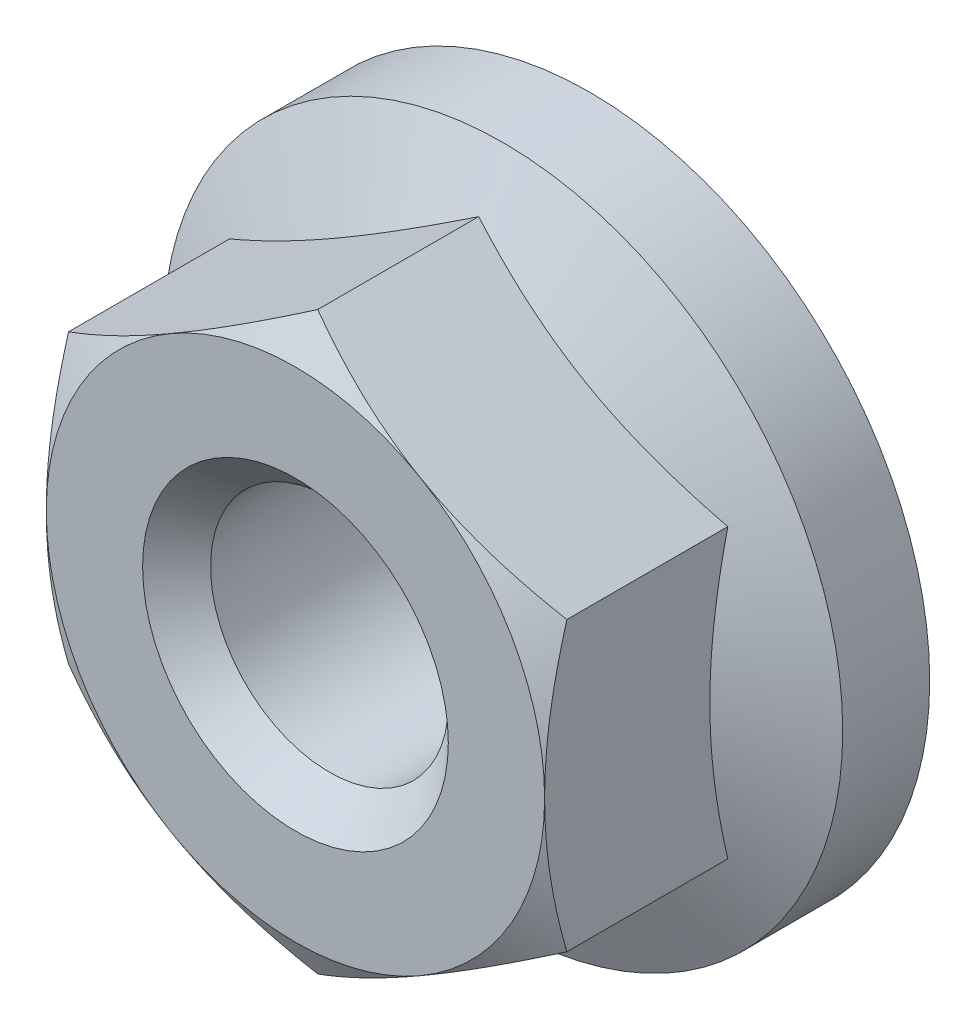
ISO-10303-21;
HEADER;
FILE_DESCRIPTION(('STEP AP214'),'2;1');
FILE_NAME('part.step','',(''),(''),'','','');
FILE_SCHEMA(('AUTOMOTIVE_DESIGN { 1 0 10303 214 1 1 1 1 }'));
ENDSEC;
DATA;
#1=APPLICATION_CONTEXT('core data for automotive mechanical design processes');
#2=APPLICATION_PROTOCOL_DEFINITION('international standard','automotive_design',2000,#1);
#3=PRODUCT_CONTEXT('',#1,'mechanical');
#4=PRODUCT('Part','Part','',(#3));
#5=PRODUCT_RELATED_PRODUCT_CATEGORY('part','',(#4));
#6=PRODUCT_DEFINITION_FORMATION('','',#4);
#7=PRODUCT_DEFINITION_CONTEXT('part definition',#1,'design');
#8=PRODUCT_DEFINITION('design','',#6,#7);
#9=PRODUCT_DEFINITION_SHAPE('','',#8);
#10=(LENGTH_UNIT() NAMED_UNIT(*) SI_UNIT(.MILLI.,.METRE.));
#11=(NAMED_UNIT(*) PLANE_ANGLE_UNIT() SI_UNIT($,.RADIAN.));
#12=(NAMED_UNIT(*) SI_UNIT($,.STERADIAN.) SOLID_ANGLE_UNIT());
#13=UNCERTAINTY_MEASURE_WITH_UNIT(LENGTH_MEASURE(1.E-05),#10,'distance_accuracy_value','');
#14=(GEOMETRIC_REPRESENTATION_CONTEXT(3) GLOBAL_UNCERTAINTY_ASSIGNED_CONTEXT((#13)) GLOBAL_UNIT_ASSIGNED_CONTEXT((#10,
#11,#12)) REPRESENTATION_CONTEXT('',''));
#15=CARTESIAN_POINT('',(0.,0.,0.));
#16=DIRECTION('',(0.,0.,1.));
#17=DIRECTION('',(1.,0.,0.));
#18=AXIS2_PLACEMENT_3D('',#15,#16,#17);
#19=CARTESIAN_POINT('',(0.,0.,-1.0556875));
#20=DIRECTION('',(0.,0.,-1.));
#21=DIRECTION('',(-1.,0.,0.));
#22=AXIS2_PLACEMENT_3D('',#19,#20,#21);
#23=CYLINDRICAL_SURFACE('',#22,2.0828);
#24=CARTESIAN_POINT('',(0.,0.,1.984375));
#25=DIRECTION('',(0.,0.,1.));
#26=DIRECTION('',(1.,0.,0.));
#27=AXIS2_PLACEMENT_3D('',#24,#25,#26);
#28=CIRCLE('',#27,2.0828);
#29=CARTESIAN_POINT('',(2.0828,0.,1.984375));
#30=VERTEX_POINT('',#29);
#31=EDGE_CURVE('E250',#30,#30,#28,.T.);
#32=ORIENTED_EDGE('',*,*,#31,.T.);
#33=EDGE_LOOP('',(#32));
#34=FACE_BOUND('',#33,.T.);
#35=CARTESIAN_POINT('',(0.,0.,-1.984375));
#36=DIRECTION('',(0.,0.,1.));
#37=DIRECTION('',(1.,0.,0.));
#38=AXIS2_PLACEMENT_3D('',#35,#36,#37);
#39=CIRCLE('',#38,2.0828);
#40=CARTESIAN_POINT('',(2.0828,0.,-1.984375));
#41=VERTEX_POINT('',#40);
#42=EDGE_CURVE('E53',#41,#41,#39,.F.);
#43=ORIENTED_EDGE('',*,*,#42,.T.);
#44=EDGE_LOOP('',(#43));
#45=FACE_BOUND('',#44,.T.);
#46=ADVANCED_FACE('F45',(#34,#45),#23,.F.);
#47=CARTESIAN_POINT('',(4.36562499999999,-2.52049476893095,2.5796875));
#48=DIRECTION('',(-1.,0.,0.));
#49=DIRECTION('',(0.,-1.,0.));
#50=AXIS2_PLACEMENT_3D('',#47,#48,#49);
#51=PLANE('',#50);
#52=CARTESIAN_POINT('',(4.365625,-6.60664399345358,-1.97226833605388));
#53=CARTESIAN_POINT('',(4.365625,-6.41093281341259,-1.89615105212342));
#54=CARTESIAN_POINT('',(4.365625,-6.21488345839632,-1.82088675112231));
#55=CARTESIAN_POINT('',(4.365625,-5.8219287229827,-1.6725494974028));
#56=CARTESIAN_POINT('',(4.365625,-5.62502323224388,-1.59947683734957));
#57=CARTESIAN_POINT('',(4.365625,-5.22954152141942,-1.45577913541881));
#58=CARTESIAN_POINT('',(4.365625,-5.03096187173488,-1.38516349683207));
#59=CARTESIAN_POINT('',(4.365625,-4.63262717448217,-1.2473392366526));
#60=CARTESIAN_POINT('',(4.365625,-4.43287216970846,-1.18013049186178));
#61=CARTESIAN_POINT('',(4.365625,-4.0352396282442,-1.05106617516828));
#62=CARTESIAN_POINT('',(4.365625,-3.83738479335021,-0.989141045710431));
#63=CARTESIAN_POINT('',(4.365625,-3.44009112088732,-0.87052511400839));
#64=CARTESIAN_POINT('',(4.36562499999999,-3.24065220149484,-0.813834584084636));
#65=CARTESIAN_POINT('',(4.36562499999999,-2.8401925308117,-0.707117768321716));
#66=CARTESIAN_POINT('',(4.36562499999999,-2.63917357656096,-0.657084822820685));
#67=CARTESIAN_POINT('',(4.36562499999999,-2.23528338920897,-0.565275961029053));
#68=CARTESIAN_POINT('',(4.36562499999999,-2.03241242391281,-0.523498870105913));
#69=CARTESIAN_POINT('',(4.36562499999999,-1.5502433680569,-0.436658518690269));
#70=CARTESIAN_POINT('',(4.36562499999999,-1.27011229597603,-0.39597500452531));
#71=CARTESIAN_POINT('',(4.36562499999999,-0.848209340326263,-0.352501513386403));
#72=CARTESIAN_POINT('',(4.36562499999999,-0.707314635336784,-0.340936119764732));
#73=CARTESIAN_POINT('',(4.36562499999999,-0.425143611925475,-0.32401529121301));
#74=CARTESIAN_POINT('',(4.36562499999999,-0.283867296581308,-0.318659806349439));
#75=CARTESIAN_POINT('',(4.36562499999999,-0.000398275889843799,-0.314345605247682));
#76=CARTESIAN_POINT('',(4.36562499999999,0.141794995613756,-0.315424137943703));
#77=CARTESIAN_POINT('',(4.36562499999999,0.425987036683269,-0.32402350415237));
#78=CARTESIAN_POINT('',(4.36562499999999,0.567985802407583,-0.331544463120178));
#79=CARTESIAN_POINT('',(4.36562499999999,0.851547659651012,-0.352762073380852));
#80=CARTESIAN_POINT('',(4.36562499999999,0.993110652860779,-0.366460028159263));
#81=CARTESIAN_POINT('',(4.36562499999999,1.27554275363206,-0.399580245891768));
#82=CARTESIAN_POINT('',(4.36562499999999,1.4164119098734,-0.41900210126684));
#83=CARTESIAN_POINT('',(4.36562499999999,2.00067719219713,-0.510509317060275));
#84=CARTESIAN_POINT('',(4.36562499999999,2.44050875761812,-0.605755319055588));
#85=CARTESIAN_POINT('',(4.36562499999999,3.09369680564782,-0.773315191169257));
#86=CARTESIAN_POINT('',(4.36562499999999,3.31052251368921,-0.833347923015837));
#87=CARTESIAN_POINT('',(4.36562499999999,3.74229501139436,-0.959863450758469));
#88=CARTESIAN_POINT('',(4.36562499999999,3.95724198038637,-1.02634562355258));
#89=CARTESIAN_POINT('',(4.36562499999999,4.38695059391623,-1.16477392669879));
#90=CARTESIAN_POINT('',(4.36562499999999,4.60170114849319,-1.23675397688996));
#91=CARTESIAN_POINT('',(4.36562499999999,5.02983726821637,-1.38466760127381));
#92=CARTESIAN_POINT('',(4.36562499999999,5.24322281220871,-1.46060123657025));
#93=CARTESIAN_POINT('',(4.36562499999999,5.66870443171552,-1.6155187648014));
#94=CARTESIAN_POINT('',(4.36562499999999,5.88080132708559,-1.69450041556498));
#95=CARTESIAN_POINT('',(4.36562499999999,6.30405963762542,-1.85493580058842));
#96=CARTESIAN_POINT('',(4.36562499999999,6.51522103745028,-1.93638957522767));
#97=CARTESIAN_POINT('',(4.36562499999999,7.14592518038851,-2.18306875846791));
#98=CARTESIAN_POINT('',(4.36562499999999,7.56432371053481,-2.35121691841306));
#99=CARTESIAN_POINT('',(4.36562499999999,8.39906567581811,-2.69273368884814));
#100=CARTESIAN_POINT('',(4.36562499999999,8.81540869142238,-2.86610331762184));
#101=CARTESIAN_POINT('',(4.36562499999999,9.64042944190495,-3.21388577952443));
#102=CARTESIAN_POINT('',(4.36562499999999,10.0491296197722,-3.38824545430547));
#103=CARTESIAN_POINT('',(4.36562499999999,10.661300445411,-3.65167502902517));
#104=CARTESIAN_POINT('',(4.36562499999998,10.865184067515,-3.739788189516));
#105=CARTESIAN_POINT('',(4.36562499999998,11.2727099754698,-3.91656846544385));
#106=CARTESIAN_POINT('',(4.36562499999998,11.4763522623943,-4.00523557840539));
#107=CARTESIAN_POINT('',(4.36562499999998,11.679891685479,-4.09413834940731));
#108=B_SPLINE_CURVE_WITH_KNOTS('',3,(#52,#53,#54,#55,#56,#57,#58,#59,#60,#61,#62,#63,#64,#65,
#66,#67,#68,#69,#70,#71,#72,#73,#74,#75,#76,#77,#78,#79,#80,#81,#82,#83,#84,#85,#86,#87,#88,#89,
#90,#91,#92,#93,#94,#95,#96,#97,#98,#99,#100,#101,#102,#103,#104,#105,#106,#107),.UNSPECIFIED.,
.F.,.F.,(4,2,2,2,2,2,2,2,2,2,2,2,2,2,2,2,2,2,2,2,2,2,2,2,2,2,2,4),(0.,0.629983444310105,
1.26005064351588,1.89231061306488,2.52454770286732,3.14644779877676,3.76838022969133,
4.38968578072315,5.01090286944214,5.85917091266729,6.28316135355655,6.70714838513929,
7.13359240922861,7.56004473777006,7.98658709952139,8.41309909601237,9.76057542104153,
10.4355130688722,11.1103855735503,11.7898234040978,12.469271738662,13.1482294465624,
13.8271982504528,15.1799045303391,16.5328763435044,17.8658803218238,18.5322071336423,
19.1985309699511),.UNSPECIFIED.);
#109=CARTESIAN_POINT('',(4.36562499999999,2.52049476893097,-0.630351748730272));
#110=VERTEX_POINT('',#109);
#111=CARTESIAN_POINT('',(4.36562499999999,-2.52049476893095,-0.630351748730269));
#112=VERTEX_POINT('',#111);
#113=EDGE_CURVE('E60',#110,#112,#108,.F.);
#114=ORIENTED_EDGE('',*,*,#113,.F.);
#115=DIRECTION('',(0.,0.,-1.));
#116=VECTOR('',#115,1.);
#117=CARTESIAN_POINT('',(4.36562499999999,2.52049476893097,2.5796875));
#118=LINE('',#117,#116);
#119=CARTESIAN_POINT('',(4.36562500000001,2.52049476893096,2.1897656022643));
#120=VERTEX_POINT('',#119);
#121=EDGE_CURVE('E233',#120,#110,#118,.T.);
#122=ORIENTED_EDGE('',*,*,#121,.F.);
#123=CARTESIAN_POINT('',(4.365625,-6.68472357029108,0.490619352130386));
#124=CARTESIAN_POINT('',(4.365625,-6.49304794649147,0.583247601576225));
#125=CARTESIAN_POINT('',(4.365625,-6.30091913696138,0.674955049234821));
#126=CARTESIAN_POINT('',(4.365625,-5.91551011235036,0.856002163894497));
#127=CARTESIAN_POINT('',(4.365625,-5.72222970491905,0.945341420940688));
#128=CARTESIAN_POINT('',(4.365625,-5.33322836526829,1.12159662139672));
#129=CARTESIAN_POINT('',(4.365625,-5.13749979647848,1.20849577146979));
#130=CARTESIAN_POINT('',(4.365625,-4.74443393172761,1.37856153998718));
#131=CARTESIAN_POINT('',(4.365625,-4.54709672025723,1.46172835299123));
#132=CARTESIAN_POINT('',(4.365625,-4.14804997464603,1.62432433210982));
#133=CARTESIAN_POINT('',(4.365625,-3.94631650504855,1.7036950764364));
#134=CARTESIAN_POINT('',(4.365625,-3.54046995624347,1.85622022770319));
#135=CARTESIAN_POINT('',(4.36562499999999,-3.33635661515233,1.92937394303145));
#136=CARTESIAN_POINT('',(4.36562499999999,-2.92584550484026,2.06749959311642));
#137=CARTESIAN_POINT('',(4.36562499999999,-2.71945364770364,2.13248892229756));
#138=CARTESIAN_POINT('',(4.36562499999999,-2.30373377742746,2.25217449846454));
#139=CARTESIAN_POINT('',(4.36562499999999,-2.09440671538953,2.30687400048986));
#140=CARTESIAN_POINT('',(4.36562499999999,-1.6726830200161,2.40332685882437));
#141=CARTESIAN_POINT('',(4.36562499999999,-1.46028558509209,2.44507676805484));
#142=CARTESIAN_POINT('',(4.36562499999999,-1.03290172953048,2.5128103168927));
#143=CARTESIAN_POINT('',(4.36562499999999,-0.817915306604055,2.5387939425607));
#144=CARTESIAN_POINT('',(4.36562499999999,-0.495089233151992,2.56427521684339));
#145=CARTESIAN_POINT('',(4.36562499999999,-0.387757075852365,2.57052124859524));
#146=CARTESIAN_POINT('',(4.36562499999999,-0.172927392335542,2.57847074854163));
#147=CARTESIAN_POINT('',(4.36562499999999,-0.0654298682840093,2.58017427572705));
#148=CARTESIAN_POINT('',(4.36562499999999,0.256965307685626,2.57836344443623));
#149=CARTESIAN_POINT('',(4.36562499999999,0.471867877291875,2.56793588098127));
#150=CARTESIAN_POINT('',(4.36562499999999,0.838818659922764,2.53507363216862));
#151=CARTESIAN_POINT('',(4.36562499999999,0.991279829530546,2.51692149116043));
#152=CARTESIAN_POINT('',(4.36562499999999,1.29502515414939,2.47249569049691));
#153=CARTESIAN_POINT('',(4.36562499999999,1.44630914944927,2.44622094785863));
#154=CARTESIAN_POINT('',(4.36562499999999,1.89827339753187,2.35658791641639));
#155=CARTESIAN_POINT('',(4.36562499999999,2.19683386468751,2.28244427940829));
#156=CARTESIAN_POINT('',(4.36562499999999,2.64358506393704,2.1545668821533));
#157=CARTESIAN_POINT('',(4.36562499999999,2.79410405673737,2.10851219794181));
#158=CARTESIAN_POINT('',(4.36562499999999,3.09357094763501,2.01184566510832));
#159=CARTESIAN_POINT('',(4.36562499999999,3.24251985129302,1.96123695971366));
#160=CARTESIAN_POINT('',(4.36562499999999,3.53822380892041,1.85651549643316));
#161=CARTESIAN_POINT('',(4.36562499999999,3.68498649235853,1.80242406509119));
#162=CARTESIAN_POINT('',(4.36562499999999,3.97737317703636,1.69106632903171));
#163=CARTESIAN_POINT('',(4.36562499999999,4.12299669053638,1.6337987411384));
#164=CARTESIAN_POINT('',(4.36562499999999,4.26809365222194,1.57525649832899));
#165=B_SPLINE_CURVE_WITH_KNOTS('',3,(#123,#124,#125,#126,#127,#128,#129,#130,#131,#132,#133,
#134,#135,#136,#137,#138,#139,#140,#141,#142,#143,#144,#145,#146,#147,#148,#149,#150,#151,#152,
#153,#154,#155,#156,#157,#158,#159,#160,#161,#162,#163,#164),.UNSPECIFIED.,.F.,.F.,(4,2,2,2,2,2,
2,2,2,2,2,2,2,2,2,2,2,2,2,2,4),(0.,0.638660151693423,1.27743014855248,1.91985556812849,
2.56224746028049,3.21252593119908,3.86287664776039,4.51181739048863,5.16055250362408,
5.80946015698262,6.45836838405626,6.78082333641526,7.10327410121856,7.74786871494334,
8.2082680220623,8.6687287405146,9.59034671260758,10.0625304265247,10.5343906987153,
11.0035950242802,11.4729903103898),.UNSPECIFIED.);
#166=CARTESIAN_POINT('',(4.36562499999999,0.,2.5796875));
#167=VERTEX_POINT('',#166);
#168=EDGE_CURVE('E219',#167,#120,#165,.T.);
#169=ORIENTED_EDGE('',*,*,#168,.F.);
#170=CARTESIAN_POINT('',(4.36562500000002,-2.52049476893094,2.1897656022643));
#171=VERTEX_POINT('',#170);
#172=EDGE_CURVE('E225',#171,#167,#165,.T.);
#173=ORIENTED_EDGE('',*,*,#172,.F.);
#174=DIRECTION('',(0.,0.,-1.));
#175=VECTOR('',#174,1.);
#176=CARTESIAN_POINT('',(4.36562499999999,-2.52049476893095,2.5796875));
#177=LINE('',#176,#175);
#178=EDGE_CURVE('E130',#171,#112,#177,.T.);
#179=ORIENTED_EDGE('',*,*,#178,.T.);
#180=EDGE_LOOP('',(#114,#122,#169,#173,#179));
#181=FACE_BOUND('',#180,.T.);
#182=ADVANCED_FACE('F198',(#181),#51,.F.);
#183=CARTESIAN_POINT('',(4.36562499999999,2.52049476893097,2.5796875));
#184=DIRECTION('',(-0.5,-0.866025403784439,0.));
#185=DIRECTION('',(0.866025403784439,-0.5,0.));
#186=AXIS2_PLACEMENT_3D('',#183,#184,#185);
#187=PLANE('',#186);
#188=CARTESIAN_POINT('',(-0.00020000000000374,5.04110500791577,-0.63040559515069));
#189=CARTESIAN_POINT('',(0.131826476473051,4.96487948618389,-0.594860279484385));
#190=CARTESIAN_POINT('',(0.264340111578985,4.88837270328418,-0.561597535493241));
#191=CARTESIAN_POINT('',(0.530361820455057,4.7347849980543,-0.50042952303362));
#192=CARTESIAN_POINT('',(0.663870391926843,4.65770378837594,-0.472527153156951));
#193=CARTESIAN_POINT('',(0.931885071333244,4.50296544107388,-0.422889063792162));
#194=CARTESIAN_POINT('',(1.0663919965592,4.42530783158681,-0.401159145422321));
#195=CARTESIAN_POINT('',(1.33609546225337,4.26959446306691,-0.364668082825573));
#196=CARTESIAN_POINT('',(1.47129186870673,4.19153878140759,-0.349905632875203));
#197=CARTESIAN_POINT('',(1.73934156536304,4.03678021688687,-0.328165012874994));
#198=CARTESIAN_POINT('',(1.87218531219099,3.9600828438956,-0.321031779418591));
#199=CARTESIAN_POINT('',(2.13802605915345,3.80659961707524,-0.314311443738025));
#200=CARTESIAN_POINT('',(2.2710230679426,3.72981375824942,-0.314724790882686));
#201=CARTESIAN_POINT('',(2.53671265532347,3.57641780345419,-0.3230767786528));
#202=CARTESIAN_POINT('',(2.66940540211807,3.49980761037282,-0.3310084055696));
#203=CARTESIAN_POINT('',(2.93430604759444,3.34686715139853,-0.354055451574821));
#204=CARTESIAN_POINT('',(3.06651398927821,3.2705368606784,-0.369170217189841));
#205=CARTESIAN_POINT('',(3.29616871952191,3.13794564035153,-0.401246827108555));
#206=CARTESIAN_POINT('',(3.39377465467736,3.08159282741502,-0.416723449578685));
#207=CARTESIAN_POINT('',(3.58854028789373,2.96914483664866,-0.451019313725859));
#208=CARTESIAN_POINT('',(3.68570000432623,2.91304964821197,-0.46983841649846));
#209=CARTESIAN_POINT('',(3.88032395573245,2.80068345747685,-0.510675646183818));
#210=CARTESIAN_POINT('',(3.97778427494457,2.74441471594442,-0.532718468045618));
#211=CARTESIAN_POINT('',(4.17218952681947,2.63217479144257,-0.579567865033983));
#212=CARTESIAN_POINT('',(4.26913454300124,2.57620356025343,-0.604373977037499));
#213=CARTESIAN_POINT('',(4.36582499999999,2.52037929887713,-0.630405595150681));
#214=B_SPLINE_CURVE_WITH_KNOTS('',3,(#188,#189,#190,#191,#192,#193,#194,#195,#196,#197,#198,
#199,#200,#201,#202,#203,#204,#205,#206,#207,#208,#209,#210,#211,#212,#213),.UNSPECIFIED.,.F.,
.F.,(4,2,2,2,2,2,2,2,2,2,2,2,4),(0.,0.469646851478608,0.939546951369879,1.40988723200695,
1.88013933450051,2.34064054105605,2.80116916871416,3.26126859739288,3.72132617734602,
4.06256608371574,4.40379181239433,4.74778354166053,5.09171770495247),.UNSPECIFIED.);
#215=CARTESIAN_POINT('',(0.,5.04098953786193,-0.630351748730276));
#216=VERTEX_POINT('',#215);
#217=EDGE_CURVE('E67',#216,#110,#214,.T.);
#218=ORIENTED_EDGE('',*,*,#217,.F.);
#219=DIRECTION('',(0.,0.,-1.));
#220=VECTOR('',#219,1.);
#221=CARTESIAN_POINT('',(0.,5.04098953786193,2.5796875));
#222=LINE('',#221,#220);
#223=CARTESIAN_POINT('',(0.,5.04098953786193,2.1897656022643));
#224=VERTEX_POINT('',#223);
#225=EDGE_CURVE('E231',#224,#216,#222,.T.);
#226=ORIENTED_EDGE('',*,*,#225,.F.);
#227=CARTESIAN_POINT('',(4.36582499999999,2.52037929887713,2.18969893330707));
#228=CARTESIAN_POINT('',(4.17397884524336,2.63114172796887,2.25367053939288));
#229=CARTESIAN_POINT('',(3.98047668465206,2.74286025247503,2.31185020339327));
#230=CARTESIAN_POINT('',(3.59012172786329,2.96823179185653,2.41340297894961));
#231=CARTESIAN_POINT('',(3.39326199603344,3.08188881102109,2.45674016558375));
#232=CARTESIAN_POINT('',(3.00198221769428,3.30779429637366,2.52420024711872));
#233=CARTESIAN_POINT('',(2.80762237147348,3.4200080059089,2.5487721340745));
#234=CARTESIAN_POINT('',(2.41798823215202,3.64496338113161,2.57810489318914));
#235=CARTESIAN_POINT('',(2.22271535509829,3.75770422926401,2.5828900564277));
#236=CARTESIAN_POINT('',(1.85784257149213,3.968363629099,2.57293087568916));
#237=CARTESIAN_POINT('',(1.68818802211312,4.06631372885221,2.56063184705368));
#238=CARTESIAN_POINT('',(1.34998421225434,4.26157578951514,2.52165250734802));
#239=CARTESIAN_POINT('',(1.18143612140104,4.35888707514069,2.49495888313893));
#240=CARTESIAN_POINT('',(0.842535099477596,4.55455167137683,2.42822742336617));
#241=CARTESIAN_POINT('',(0.672225057879171,4.65288021973937,2.38790673834841));
#242=CARTESIAN_POINT('',(0.334144990416693,4.84807083769648,2.29639484471812));
#243=CARTESIAN_POINT('',(0.16637063383711,4.94493540763082,2.24522513580728));
#244=CARTESIAN_POINT('',(-0.000200000000004087,5.04110500791577,2.18969893330706));
#245=B_SPLINE_CURVE_WITH_KNOTS('',3,(#227,#228,#229,#230,#231,#232,#233,#234,#235,#236,#237,
#238,#239,#240,#241,#242,#243,#244),.UNSPECIFIED.,.F.,.F.,(4,2,2,2,2,2,2,2,4),(0.,
0.692002325262094,1.38566793682621,2.06216593124082,2.73783317900963,3.32613108280981,
3.91497402160195,4.51687782793767,5.11759979729737),.UNSPECIFIED.);
#246=CARTESIAN_POINT('',(2.1828125,3.78074215339644,2.5796875));
#247=VERTEX_POINT('',#246);
#248=EDGE_CURVE('E204',#247,#224,#245,.T.);
#249=ORIENTED_EDGE('',*,*,#248,.F.);
#250=EDGE_CURVE('E211',#120,#247,#245,.T.);
#251=ORIENTED_EDGE('',*,*,#250,.F.);
#252=ORIENTED_EDGE('',*,*,#121,.T.);
#253=EDGE_LOOP('',(#218,#226,#249,#251,#252));
#254=FACE_BOUND('',#253,.T.);
#255=ADVANCED_FACE('F194',(#254),#187,.F.);
#256=CARTESIAN_POINT('',(0.,5.04098953786193,2.5796875));
#257=DIRECTION('',(0.5,-0.866025403784438,0.));
#258=DIRECTION('',(0.866025403784438,0.5,0.));
#259=AXIS2_PLACEMENT_3D('',#256,#257,#258);
#260=PLANE('',#259);
#261=CARTESIAN_POINT('',(-4.365825,2.52037929887713,-0.630405595150689));
#262=CARTESIAN_POINT('',(-4.23379852352695,2.596604820609,-0.594860279484385));
#263=CARTESIAN_POINT('',(-4.10128488842102,2.67311160350871,-0.561597535493242));
#264=CARTESIAN_POINT('',(-3.83526317954494,2.82669930873859,-0.50042952303362));
#265=CARTESIAN_POINT('',(-3.70175460807316,2.90378051841695,-0.472527153156951));
#266=CARTESIAN_POINT('',(-3.43373992866676,3.05851886571901,-0.422889063792162));
#267=CARTESIAN_POINT('',(-3.2992330034408,3.13617647520608,-0.401159145422321));
#268=CARTESIAN_POINT('',(-3.02952953774664,3.29188984372598,-0.364668082825574));
#269=CARTESIAN_POINT('',(-2.89433313129327,3.36994552538531,-0.349905632875203));
#270=CARTESIAN_POINT('',(-2.62628343463697,3.52470408990602,-0.328165012874994));
#271=CARTESIAN_POINT('',(-2.49343968780902,3.60140146289729,-0.321031779418592));
#272=CARTESIAN_POINT('',(-2.22759894084655,3.75488468971765,-0.314311443738026));
#273=CARTESIAN_POINT('',(-2.09460193205741,3.83167054854347,-0.314724790882687));
#274=CARTESIAN_POINT('',(-1.82891234467654,3.9850665033387,-0.323076778652801));
#275=CARTESIAN_POINT('',(-1.69621959788193,4.06167669642008,-0.331008405569601));
#276=CARTESIAN_POINT('',(-1.43131895240556,4.21461715539436,-0.354055451574821));
#277=CARTESIAN_POINT('',(-1.29911101072179,4.29094744611449,-0.369170217189842));
#278=CARTESIAN_POINT('',(-1.06945628047809,4.42353866644136,-0.401246827108556));
#279=CARTESIAN_POINT('',(-0.971850345322642,4.47989147937787,-0.416723449578686));
#280=CARTESIAN_POINT('',(-0.777084712106271,4.59233947014423,-0.45101931372586));
#281=CARTESIAN_POINT('',(-0.67992499567377,4.64843465858092,-0.469838416498462));
#282=CARTESIAN_POINT('',(-0.485301044267554,4.76080084931605,-0.51067564618382));
#283=CARTESIAN_POINT('',(-0.387840725055425,4.81706959084848,-0.532718468045621));
#284=CARTESIAN_POINT('',(-0.193435473180524,4.92930951535033,-0.579567865033987));
#285=CARTESIAN_POINT('',(-0.0964904569987509,4.98528074653947,-0.604373977037503));
#286=CARTESIAN_POINT('',(0.000199999999997226,5.04110500791577,-0.630405595150686));
#287=B_SPLINE_CURVE_WITH_KNOTS('',3,(#261,#262,#263,#264,#265,#266,#267,#268,#269,#270,#271,
#272,#273,#274,#275,#276,#277,#278,#279,#280,#281,#282,#283,#284,#285,#286),.UNSPECIFIED.,.F.,
.F.,(4,2,2,2,2,2,2,2,2,2,2,2,4),(0.,0.469646851478607,0.939546951369878,1.40988723200695,
1.88013933450051,2.34064054105604,2.80116916871415,3.26126859739288,3.72132617734602,
4.06256608371574,4.40379181239433,4.74778354166054,5.09171770495248),.UNSPECIFIED.);
#288=CARTESIAN_POINT('',(-4.365625,2.52049476893096,-0.630351748730276));
#289=VERTEX_POINT('',#288);
#290=EDGE_CURVE('E176',#289,#216,#287,.T.);
#291=ORIENTED_EDGE('',*,*,#290,.F.);
#292=DIRECTION('',(0.,0.,-1.));
#293=VECTOR('',#292,1.);
#294=CARTESIAN_POINT('',(-4.365625,2.52049476893096,2.5796875));
#295=LINE('',#294,#293);
#296=CARTESIAN_POINT('',(-4.365625,2.52049476893097,2.1897656022643));
#297=VERTEX_POINT('',#296);
#298=EDGE_CURVE('E228',#297,#289,#295,.T.);
#299=ORIENTED_EDGE('',*,*,#298,.F.);
#300=CARTESIAN_POINT('',(0.000199999999996312,5.04110500791577,2.18969893330706));
#301=CARTESIAN_POINT('',(-0.191646154756636,4.93034257882403,2.25367053939287));
#302=CARTESIAN_POINT('',(-0.385148315347938,4.81862405431787,2.31185020339327));
#303=CARTESIAN_POINT('',(-0.775503272136701,4.59325251493637,2.4134029789496));
#304=CARTESIAN_POINT('',(-0.972363003966554,4.47959549577181,2.45674016558374));
#305=CARTESIAN_POINT('',(-1.36364278230571,4.25369001041924,2.52420024711872));
#306=CARTESIAN_POINT('',(-1.55800262852651,4.141476300884,2.5487721340745));
#307=CARTESIAN_POINT('',(-1.94763676784797,3.91652092566129,2.57810489318914));
#308=CARTESIAN_POINT('',(-2.1429096449017,3.80378007752888,2.5828900564277));
#309=CARTESIAN_POINT('',(-2.50778242850787,3.5931206776939,2.57293087568916));
#310=CARTESIAN_POINT('',(-2.67743697788688,3.49517057794068,2.56063184705368));
#311=CARTESIAN_POINT('',(-3.01564078774566,3.29990851727776,2.52165250734802));
#312=CARTESIAN_POINT('',(-3.18418887859896,3.20259723165221,2.49495888313893));
#313=CARTESIAN_POINT('',(-3.5230899005224,3.00693263541607,2.42822742336617));
#314=CARTESIAN_POINT('',(-3.69339994212083,2.90860408705352,2.38790673834841));
#315=CARTESIAN_POINT('',(-4.03148000958331,2.71341346909641,2.29639484471812));
#316=CARTESIAN_POINT('',(-4.19925436616289,2.61654889916207,2.24522513580728));
#317=CARTESIAN_POINT('',(-4.365825,2.52037929887713,2.18969893330706));
#318=B_SPLINE_CURVE_WITH_KNOTS('',3,(#300,#301,#302,#303,#304,#305,#306,#307,#308,#309,#310,
#311,#312,#313,#314,#315,#316,#317),.UNSPECIFIED.,.F.,.F.,(4,2,2,2,2,2,2,2,4),(0.,
0.692002325262095,1.38566793682621,2.06216593124082,2.73783317900963,3.32613108280982,
3.91497402160196,4.51687782793768,5.11759979729738),.UNSPECIFIED.);
#319=CARTESIAN_POINT('',(-2.18281250000001,3.78074215339645,2.5796875));
#320=VERTEX_POINT('',#319);
#321=EDGE_CURVE('E213',#320,#297,#318,.T.);
#322=ORIENTED_EDGE('',*,*,#321,.F.);
#323=EDGE_CURVE('E212',#224,#320,#318,.T.);
#324=ORIENTED_EDGE('',*,*,#323,.F.);
#325=ORIENTED_EDGE('',*,*,#225,.T.);
#326=EDGE_LOOP('',(#291,#299,#322,#324,#325));
#327=FACE_BOUND('',#326,.T.);
#328=ADVANCED_FACE('F197',(#327),#260,.F.);
#329=CARTESIAN_POINT('',(-4.365625,2.52049476893096,2.5796875));
#330=DIRECTION('',(1.,0.,0.));
#331=DIRECTION('',(0.,0.,-1.));
#332=AXIS2_PLACEMENT_3D('',#329,#330,#331);
#333=PLANE('',#332);
#334=CARTESIAN_POINT('',(-4.365625,-6.6066439934536,-1.97226833605389));
#335=CARTESIAN_POINT('',(-4.365625,-6.41093281341261,-1.89615105212343));
#336=CARTESIAN_POINT('',(-4.365625,-6.21488345839633,-1.82088675112232));
#337=CARTESIAN_POINT('',(-4.365625,-5.82192872298271,-1.67254949740281));
#338=CARTESIAN_POINT('',(-4.365625,-5.62502323224389,-1.59947683734958));
#339=CARTESIAN_POINT('',(-4.365625,-5.22954152141944,-1.45577913541882));
#340=CARTESIAN_POINT('',(-4.365625,-5.03096187173489,-1.38516349683208));
#341=CARTESIAN_POINT('',(-4.365625,-4.63262717448218,-1.24733923665261));
#342=CARTESIAN_POINT('',(-4.365625,-4.43287216970847,-1.18013049186179));
#343=CARTESIAN_POINT('',(-4.365625,-4.03523962824421,-1.05106617516828));
#344=CARTESIAN_POINT('',(-4.365625,-3.83738479335022,-0.989141045710437));
#345=CARTESIAN_POINT('',(-4.365625,-3.44009112088733,-0.870525114008396));
#346=CARTESIAN_POINT('',(-4.365625,-3.24065220149485,-0.813834584084642));
#347=CARTESIAN_POINT('',(-4.365625,-2.8401925308117,-0.707117768321721));
#348=CARTESIAN_POINT('',(-4.365625,-2.63917357656096,-0.65708482282069));
#349=CARTESIAN_POINT('',(-4.365625,-2.23528338920898,-0.565275961029057));
#350=CARTESIAN_POINT('',(-4.365625,-2.03241242391281,-0.523498870105917));
#351=CARTESIAN_POINT('',(-4.365625,-1.5502433680569,-0.436658518690275));
#352=CARTESIAN_POINT('',(-4.365625,-1.27011229597603,-0.395975004525316));
#353=CARTESIAN_POINT('',(-4.365625,-0.848209340326264,-0.352501513386409));
#354=CARTESIAN_POINT('',(-4.365625,-0.707314635336785,-0.340936119764737));
#355=CARTESIAN_POINT('',(-4.365625,-0.425143611925475,-0.324015291213015));
#356=CARTESIAN_POINT('',(-4.365625,-0.283867296581308,-0.318659806349444));
#357=CARTESIAN_POINT('',(-4.365625,-0.000398275889843122,-0.314345605247688));
#358=CARTESIAN_POINT('',(-4.365625,0.141794995613757,-0.315424137943709));
#359=CARTESIAN_POINT('',(-4.365625,0.425987036683271,-0.324023504152376));
#360=CARTESIAN_POINT('',(-4.365625,0.567985802407585,-0.331544463120183));
#361=CARTESIAN_POINT('',(-4.365625,0.851547659651015,-0.352762073380858));
#362=CARTESIAN_POINT('',(-4.365625,0.993110652860782,-0.366460028159269));
#363=CARTESIAN_POINT('',(-4.365625,1.27554275363207,-0.399580245891775));
#364=CARTESIAN_POINT('',(-4.365625,1.4164119098734,-0.419002101266846));
#365=CARTESIAN_POINT('',(-4.365625,2.00067719219714,-0.510509317060281));
#366=CARTESIAN_POINT('',(-4.365625,2.44050875761812,-0.605755319055594));
#367=CARTESIAN_POINT('',(-4.365625,3.09369680564783,-0.773315191169264));
#368=CARTESIAN_POINT('',(-4.365625,3.31052251368922,-0.833347923015845));
#369=CARTESIAN_POINT('',(-4.365625,3.74229501139437,-0.959863450758476));
#370=CARTESIAN_POINT('',(-4.365625,3.95724198038638,-1.02634562355259));
#371=CARTESIAN_POINT('',(-4.365625,4.38695059391623,-1.1647739266988));
#372=CARTESIAN_POINT('',(-4.365625,4.6017011484932,-1.23675397688997));
#373=CARTESIAN_POINT('',(-4.365625,5.02983726821638,-1.38466760127382));
#374=CARTESIAN_POINT('',(-4.365625,5.24322281220871,-1.46060123657025));
#375=CARTESIAN_POINT('',(-4.365625,5.66870443171552,-1.61551876480141));
#376=CARTESIAN_POINT('',(-4.365625,5.88080132708559,-1.69450041556498));
#377=CARTESIAN_POINT('',(-4.365625,6.30405963762543,-1.85493580058843));
#378=CARTESIAN_POINT('',(-4.365625,6.51522103745029,-1.93638957522768));
#379=CARTESIAN_POINT('',(-4.365625,7.14592518038851,-2.18306875846791));
#380=CARTESIAN_POINT('',(-4.365625,7.56432371053482,-2.35121691841307));
#381=CARTESIAN_POINT('',(-4.365625,8.39906567581812,-2.69273368884814));
#382=CARTESIAN_POINT('',(-4.365625,8.81540869142239,-2.86610331762185));
#383=CARTESIAN_POINT('',(-4.365625,9.64042944190495,-3.21388577952444));
#384=CARTESIAN_POINT('',(-4.365625,10.0491296197722,-3.38824545430547));
#385=CARTESIAN_POINT('',(-4.365625,10.661300445411,-3.65167502902517));
#386=CARTESIAN_POINT('',(-4.365625,10.865184067515,-3.73978818951601));
#387=CARTESIAN_POINT('',(-4.365625,11.2727099754698,-3.91656846544385));
#388=CARTESIAN_POINT('',(-4.365625,11.4763522623943,-4.0052355784054));
#389=CARTESIAN_POINT('',(-4.365625,11.679891685479,-4.09413834940731));
#390=B_SPLINE_CURVE_WITH_KNOTS('',3,(#334,#335,#336,#337,#338,#339,#340,#341,#342,#343,#344,
#345,#346,#347,#348,#349,#350,#351,#352,#353,#354,#355,#356,#357,#358,#359,#360,#361,#362,#363,
#364,#365,#366,#367,#368,#369,#370,#371,#372,#373,#374,#375,#376,#377,#378,#379,#380,#381,#382,
#383,#384,#385,#386,#387,#388,#389),.UNSPECIFIED.,.F.,.F.,(4,2,2,2,2,2,2,2,2,2,2,2,2,2,2,2,2,2,
2,2,2,2,2,2,2,2,2,4),(0.,0.629983444310108,1.26005064351589,1.89231061306489,2.52454770286733,
3.14644779877677,3.76838022969134,4.38968578072316,5.01090286944216,5.85917091266731,
6.28316135355656,6.70714838513931,7.13359240922863,7.56004473777008,7.98658709952141,
8.41309909601239,9.76057542104155,10.4355130688723,11.1103855735503,11.7898234040979,
12.469271738662,13.1482294465624,13.8271982504529,15.1799045303392,16.5328763435044,
17.8658803218238,18.5322071336423,19.1985309699511),.UNSPECIFIED.);
#391=CARTESIAN_POINT('',(-4.365625,-2.52049476893096,-0.630351748730274));
#392=VERTEX_POINT('',#391);
#393=EDGE_CURVE('E140',#392,#289,#390,.T.);
#394=ORIENTED_EDGE('',*,*,#393,.F.);
#395=DIRECTION('',(0.,0.,-1.));
#396=VECTOR('',#395,1.);
#397=CARTESIAN_POINT('',(-4.365625,-2.52049476893096,2.5796875));
#398=LINE('',#397,#396);
#399=CARTESIAN_POINT('',(-4.36562500000001,-2.52049476893095,2.1897656022643));
#400=VERTEX_POINT('',#399);
#401=EDGE_CURVE('E129',#400,#392,#398,.T.);
#402=ORIENTED_EDGE('',*,*,#401,.F.);
#403=CARTESIAN_POINT('',(-4.365625,-6.6847235702911,0.490619352130377));
#404=CARTESIAN_POINT('',(-4.365625,-6.49304794649149,0.583247601576216));
#405=CARTESIAN_POINT('',(-4.365625,-6.3009191369614,0.674955049234812));
#406=CARTESIAN_POINT('',(-4.365625,-5.91551011235037,0.856002163894489));
#407=CARTESIAN_POINT('',(-4.365625,-5.72222970491906,0.94534142094068));
#408=CARTESIAN_POINT('',(-4.365625,-5.3332283652683,1.12159662139671));
#409=CARTESIAN_POINT('',(-4.365625,-5.13749979647849,1.20849577146979));
#410=CARTESIAN_POINT('',(-4.365625,-4.74443393172762,1.37856153998717));
#411=CARTESIAN_POINT('',(-4.365625,-4.54709672025724,1.46172835299122));
#412=CARTESIAN_POINT('',(-4.365625,-4.14804997464604,1.62432433210981));
#413=CARTESIAN_POINT('',(-4.365625,-3.94631650504856,1.7036950764364));
#414=CARTESIAN_POINT('',(-4.365625,-3.54046995624347,1.85622022770318));
#415=CARTESIAN_POINT('',(-4.365625,-3.33635661515234,1.92937394303145));
#416=CARTESIAN_POINT('',(-4.365625,-2.92584550484027,2.06749959311641));
#417=CARTESIAN_POINT('',(-4.365625,-2.71945364770365,2.13248892229755));
#418=CARTESIAN_POINT('',(-4.365625,-2.30373377742747,2.25217449846453));
#419=CARTESIAN_POINT('',(-4.365625,-2.09440671538954,2.30687400048985));
#420=CARTESIAN_POINT('',(-4.365625,-1.6726830200161,2.40332685882437));
#421=CARTESIAN_POINT('',(-4.365625,-1.4602855850921,2.44507676805484));
#422=CARTESIAN_POINT('',(-4.365625,-1.03290172953048,2.51281031689269));
#423=CARTESIAN_POINT('',(-4.365625,-0.817915306604054,2.5387939425607));
#424=CARTESIAN_POINT('',(-4.365625,-0.495089233151991,2.56427521684339));
#425=CARTESIAN_POINT('',(-4.365625,-0.387757075852364,2.57052124859523));
#426=CARTESIAN_POINT('',(-4.365625,-0.172927392335541,2.57847074854162));
#427=CARTESIAN_POINT('',(-4.365625,-0.0654298682840075,2.58017427572704));
#428=CARTESIAN_POINT('',(-4.365625,0.256965307685629,2.57836344443622));
#429=CARTESIAN_POINT('',(-4.365625,0.471867877291878,2.56793588098126));
#430=CARTESIAN_POINT('',(-4.365625,0.838818659922767,2.53507363216862));
#431=CARTESIAN_POINT('',(-4.365625,0.99127982953055,2.51692149116042));
#432=CARTESIAN_POINT('',(-4.365625,1.2950251541494,2.4724956904969));
#433=CARTESIAN_POINT('',(-4.365625,1.44630914944928,2.44622094785862));
#434=CARTESIAN_POINT('',(-4.365625,1.89827339753188,2.35658791641638));
#435=CARTESIAN_POINT('',(-4.365625,2.19683386468752,2.28244427940828));
#436=CARTESIAN_POINT('',(-4.365625,2.64358506393705,2.15456688215329));
#437=CARTESIAN_POINT('',(-4.365625,2.79410405673738,2.1085121979418));
#438=CARTESIAN_POINT('',(-4.365625,3.09357094763502,2.01184566510831));
#439=CARTESIAN_POINT('',(-4.365625,3.24251985129303,1.96123695971365));
#440=CARTESIAN_POINT('',(-4.365625,3.53822380892042,1.85651549643315));
#441=CARTESIAN_POINT('',(-4.365625,3.68498649235854,1.80242406509118));
#442=CARTESIAN_POINT('',(-4.365625,3.97737317703638,1.6910663290317));
#443=CARTESIAN_POINT('',(-4.365625,4.1229966905364,1.63379874113839));
#444=CARTESIAN_POINT('',(-4.365625,4.26809365222196,1.57525649832898));
#445=B_SPLINE_CURVE_WITH_KNOTS('',3,(#403,#404,#405,#406,#407,#408,#409,#410,#411,#412,#413,
#414,#415,#416,#417,#418,#419,#420,#421,#422,#423,#424,#425,#426,#427,#428,#429,#430,#431,#432,
#433,#434,#435,#436,#437,#438,#439,#440,#441,#442,#443,#444),.UNSPECIFIED.,.F.,.F.,(4,2,2,2,2,2,
2,2,2,2,2,2,2,2,2,2,2,2,2,2,4),(0.,0.638660151693423,1.27743014855248,1.91985556812849,
2.56224746028049,3.21252593119909,3.8628766477604,4.51181739048864,5.16055250362409,
5.80946015698264,6.45836838405628,6.78082333641527,7.10327410121858,7.74786871494336,
8.20826802206232,8.66872874051462,9.59034671260761,10.0625304265247,10.5343906987153,
11.0035950242802,11.4729903103898),.UNSPECIFIED.);
#446=CARTESIAN_POINT('',(-4.365625,0.,2.5796875));
#447=VERTEX_POINT('',#446);
#448=EDGE_CURVE('E315',#447,#400,#445,.F.);
#449=ORIENTED_EDGE('',*,*,#448,.F.);
#450=EDGE_CURVE('E318',#297,#447,#445,.F.);
#451=ORIENTED_EDGE('',*,*,#450,.F.);
#452=ORIENTED_EDGE('',*,*,#298,.T.);
#453=EDGE_LOOP('',(#394,#402,#449,#451,#452));
#454=FACE_BOUND('',#453,.T.);
#455=ADVANCED_FACE('F324',(#454),#333,.F.);
#456=CARTESIAN_POINT('',(-4.365625,-2.52049476893096,2.5796875));
#457=DIRECTION('',(0.5,0.866025403784439,0.));
#458=DIRECTION('',(-0.866025403784439,0.5,0.));
#459=AXIS2_PLACEMENT_3D('',#456,#457,#458);
#460=PLANE('',#459);
#461=CARTESIAN_POINT('',(0.000199999999994983,-5.04110500791576,-0.630405595150686));
#462=CARTESIAN_POINT('',(-0.13182647647306,-4.96487948618388,-0.59486027948438));
#463=CARTESIAN_POINT('',(-0.264340111578994,-4.88837270328417,-0.561597535493237));
#464=CARTESIAN_POINT('',(-0.530361820455065,-4.73478499805429,-0.500429523033615));
#465=CARTESIAN_POINT('',(-0.663870391926851,-4.65770378837593,-0.472527153156947));
#466=CARTESIAN_POINT('',(-0.931885071333251,-4.50296544107387,-0.422889063792158));
#467=CARTESIAN_POINT('',(-1.06639199655921,-4.4253078315868,-0.401159145422318));
#468=CARTESIAN_POINT('',(-1.33609546225337,-4.2695944630669,-0.36466808282557));
#469=CARTESIAN_POINT('',(-1.47129186870674,-4.19153878140758,-0.3499056328752));
#470=CARTESIAN_POINT('',(-1.73934156536304,-4.03678021688686,-0.328165012874991));
#471=CARTESIAN_POINT('',(-1.87218531219099,-3.96008284389559,-0.321031779418588));
#472=CARTESIAN_POINT('',(-2.13802605915346,-3.80659961707524,-0.314311443738023));
#473=CARTESIAN_POINT('',(-2.2710230679426,-3.72981375824941,-0.314724790882684));
#474=CARTESIAN_POINT('',(-2.53671265532347,-3.57641780345418,-0.323076778652798));
#475=CARTESIAN_POINT('',(-2.66940540211807,-3.49980761037281,-0.331008405569598));
#476=CARTESIAN_POINT('',(-2.93430604759444,-3.34686715139852,-0.354055451574818));
#477=CARTESIAN_POINT('',(-3.06651398927821,-3.27053686067839,-0.369170217189839));
#478=CARTESIAN_POINT('',(-3.29616871952191,-3.13794564035152,-0.401246827108554));
#479=CARTESIAN_POINT('',(-3.39377465467737,-3.08159282741501,-0.416723449578683));
#480=CARTESIAN_POINT('',(-3.58854028789374,-2.96914483664865,-0.451019313725858));
#481=CARTESIAN_POINT('',(-3.68570000432624,-2.91304964821196,-0.469838416498459));
#482=CARTESIAN_POINT('',(-3.88032395573245,-2.80068345747683,-0.510675646183818));
#483=CARTESIAN_POINT('',(-3.97778427494458,-2.7444147159444,-0.532718468045618));
#484=CARTESIAN_POINT('',(-4.17218952681948,-2.63217479144255,-0.579567865033984));
#485=CARTESIAN_POINT('',(-4.26913454300126,-2.57620356025341,-0.604373977037501));
#486=CARTESIAN_POINT('',(-4.36582500000001,-2.52037929887712,-0.630405595150683));
#487=B_SPLINE_CURVE_WITH_KNOTS('',3,(#461,#462,#463,#464,#465,#466,#467,#468,#469,#470,#471,
#472,#473,#474,#475,#476,#477,#478,#479,#480,#481,#482,#483,#484,#485,#486),.UNSPECIFIED.,.F.,
.F.,(4,2,2,2,2,2,2,2,2,2,2,2,4),(0.,0.469646851478607,0.939546951369877,1.40988723200695,
1.88013933450051,2.34064054105604,2.80116916871415,3.26126859739287,3.72132617734601,
4.06256608371573,4.40379181239433,4.74778354166053,5.09171770495248),.UNSPECIFIED.);
#488=CARTESIAN_POINT('',(0.,-5.04098953786192,-0.630351748730271));
#489=VERTEX_POINT('',#488);
#490=EDGE_CURVE('E134',#489,#392,#487,.T.);
#491=ORIENTED_EDGE('',*,*,#490,.F.);
#492=DIRECTION('',(0.,0.,-1.));
#493=VECTOR('',#492,1.);
#494=CARTESIAN_POINT('',(0.,-5.04098953786192,2.5796875));
#495=LINE('',#494,#493);
#496=CARTESIAN_POINT('',(0.,-5.04098953786193,2.1897656022643));
#497=VERTEX_POINT('',#496);
#498=EDGE_CURVE('E119',#497,#489,#495,.T.);
#499=ORIENTED_EDGE('',*,*,#498,.F.);
#500=CARTESIAN_POINT('',(-4.365825,-2.52037929887712,2.18969893330707));
#501=CARTESIAN_POINT('',(-4.17397884524337,-2.63114172796886,2.25367053939287));
#502=CARTESIAN_POINT('',(-3.98047668465207,-2.74286025247502,2.31185020339327));
#503=CARTESIAN_POINT('',(-3.59012172786331,-2.96823179185651,2.41340297894961));
#504=CARTESIAN_POINT('',(-3.39326199603346,-3.08188881102108,2.45674016558375));
#505=CARTESIAN_POINT('',(-3.0019822176943,-3.30779429637365,2.52420024711872));
#506=CARTESIAN_POINT('',(-2.8076223714735,-3.42000800590888,2.5487721340745));
#507=CARTESIAN_POINT('',(-2.41798823215204,-3.6449633811316,2.57810489318914));
#508=CARTESIAN_POINT('',(-2.2227153550983,-3.757704229264,2.58289005642771));
#509=CARTESIAN_POINT('',(-1.85784257149214,-3.96836362909898,2.57293087568916));
#510=CARTESIAN_POINT('',(-1.68818802211313,-4.0663137288522,2.56063184705368));
#511=CARTESIAN_POINT('',(-1.34998421225435,-4.26157578951512,2.52165250734803));
#512=CARTESIAN_POINT('',(-1.18143612140105,-4.35888707514068,2.49495888313894));
#513=CARTESIAN_POINT('',(-0.842535099477606,-4.55455167137682,2.42822742336617));
#514=CARTESIAN_POINT('',(-0.672225057879181,-4.65288021973936,2.38790673834841));
#515=CARTESIAN_POINT('',(-0.334144990416702,-4.84807083769647,2.29639484471813));
#516=CARTESIAN_POINT('',(-0.166370633837118,-4.94493540763081,2.24522513580728));
#517=CARTESIAN_POINT('',(0.000199999999995558,-5.04110500791576,2.18969893330707));
#518=B_SPLINE_CURVE_WITH_KNOTS('',3,(#500,#501,#502,#503,#504,#505,#506,#507,#508,#509,#510,
#511,#512,#513,#514,#515,#516,#517),.UNSPECIFIED.,.F.,.F.,(4,2,2,2,2,2,2,2,4),(0.,
0.692002325262094,1.38566793682621,2.06216593124082,2.73783317900963,3.32613108280982,
3.91497402160196,4.51687782793767,5.11759979729738),.UNSPECIFIED.);
#519=CARTESIAN_POINT('',(-2.1828125,-3.78074215339644,2.5796875));
#520=VERTEX_POINT('',#519);
#521=EDGE_CURVE('E305',#520,#497,#518,.T.);
#522=ORIENTED_EDGE('',*,*,#521,.F.);
#523=EDGE_CURVE('E307',#400,#520,#518,.T.);
#524=ORIENTED_EDGE('',*,*,#523,.F.);
#525=ORIENTED_EDGE('',*,*,#401,.T.);
#526=EDGE_LOOP('',(#491,#499,#522,#524,#525));
#527=FACE_BOUND('',#526,.T.);
#528=ADVANCED_FACE('F135',(#527),#460,.F.);
#529=CARTESIAN_POINT('',(0.,-5.04098953786192,2.5796875));
#530=DIRECTION('',(-0.500000000000001,0.866025403784438,0.));
#531=DIRECTION('',(-0.866025403784438,-0.500000000000001,0.));
#532=AXIS2_PLACEMENT_3D('',#529,#530,#531);
#533=PLANE('',#532);
#534=CARTESIAN_POINT('',(4.36582499999999,-2.52037929887712,-0.630405595150683));
#535=CARTESIAN_POINT('',(4.23379852352694,-2.59660482060899,-0.594860279484378));
#536=CARTESIAN_POINT('',(4.10128488842101,-2.6731116035087,-0.561597535493235));
#537=CARTESIAN_POINT('',(3.83526317954494,-2.82669930873858,-0.500429523033613));
#538=CARTESIAN_POINT('',(3.70175460807315,-2.90378051841694,-0.472527153156944));
#539=CARTESIAN_POINT('',(3.43373992866675,-3.058518865719,-0.422889063792155));
#540=CARTESIAN_POINT('',(3.29923300344079,-3.13617647520607,-0.401159145422314));
#541=CARTESIAN_POINT('',(3.02952953774663,-3.29188984372597,-0.364668082825567));
#542=CARTESIAN_POINT('',(2.89433313129326,-3.36994552538529,-0.349905632875197));
#543=CARTESIAN_POINT('',(2.62628343463696,-3.52470408990601,-0.328165012874988));
#544=CARTESIAN_POINT('',(2.49343968780901,-3.60140146289728,-0.321031779418586));
#545=CARTESIAN_POINT('',(2.22759894084655,-3.75488468971763,-0.31431144373802));
#546=CARTESIAN_POINT('',(2.0946019320574,-3.83167054854346,-0.31472479088268));
#547=CARTESIAN_POINT('',(1.82891234467653,-3.98506650333869,-0.323076778652794));
#548=CARTESIAN_POINT('',(1.69621959788193,-4.06167669642006,-0.331008405569594));
#549=CARTESIAN_POINT('',(1.43131895240556,-4.21461715539435,-0.354055451574815));
#550=CARTESIAN_POINT('',(1.29911101072179,-4.29094744611448,-0.369170217189835));
#551=CARTESIAN_POINT('',(1.06945628047809,-4.42353866644135,-0.40124682710855));
#552=CARTESIAN_POINT('',(0.971850345322637,-4.47989147937786,-0.41672344957868));
#553=CARTESIAN_POINT('',(0.777084712106265,-4.59233947014422,-0.451019313725854));
#554=CARTESIAN_POINT('',(0.679924995673764,-4.64843465858091,-0.469838416498456));
#555=CARTESIAN_POINT('',(0.485301044267547,-4.76080084931604,-0.510675646183814));
#556=CARTESIAN_POINT('',(0.387840725055418,-4.81706959084847,-0.532718468045615));
#557=CARTESIAN_POINT('',(0.193435473180516,-4.92930951535032,-0.579567865033981));
#558=CARTESIAN_POINT('',(0.0964904569987426,-4.98528074653946,-0.604373977037498));
#559=CARTESIAN_POINT('',(-0.000200000000005541,-5.04110500791576,-0.630405595150681));
#560=B_SPLINE_CURVE_WITH_KNOTS('',3,(#534,#535,#536,#537,#538,#539,#540,#541,#542,#543,#544,
#545,#546,#547,#548,#549,#550,#551,#552,#553,#554,#555,#556,#557,#558,#559),.UNSPECIFIED.,.F.,
.F.,(4,2,2,2,2,2,2,2,2,2,2,2,4),(0.,0.469646851478606,0.939546951369876,1.40988723200695,
1.8801393345005,2.34064054105604,2.80116916871414,3.26126859739287,3.72132617734601,
4.06256608371573,4.40379181239433,4.74778354166053,5.09171770495248),.UNSPECIFIED.);
#561=EDGE_CURVE('E124',#112,#489,#560,.T.);
#562=ORIENTED_EDGE('',*,*,#561,.F.);
#563=ORIENTED_EDGE('',*,*,#178,.F.);
#564=CARTESIAN_POINT('',(-0.000200000000005041,-5.04110500791576,2.18969893330707));
#565=CARTESIAN_POINT('',(0.191646154756627,-4.93034257882402,2.25367053939288));
#566=CARTESIAN_POINT('',(0.385148315347928,-4.81862405431786,2.31185020339328));
#567=CARTESIAN_POINT('',(0.77550327213669,-4.59325251493636,2.41340297894961));
#568=CARTESIAN_POINT('',(0.972363003966543,-4.4795954957718,2.45674016558375));
#569=CARTESIAN_POINT('',(1.3636427823057,-4.25369001041923,2.52420024711872));
#570=CARTESIAN_POINT('',(1.5580026285265,-4.14147630088399,2.5487721340745));
#571=CARTESIAN_POINT('',(1.94763676784796,-3.91652092566128,2.57810489318915));
#572=CARTESIAN_POINT('',(2.14290964490169,-3.80378007752888,2.58289005642771));
#573=CARTESIAN_POINT('',(2.50778242850785,-3.59312067769389,2.57293087568916));
#574=CARTESIAN_POINT('',(2.67743697788686,-3.49517057794067,2.56063184705369));
#575=CARTESIAN_POINT('',(3.01564078774564,-3.29990851727775,2.52165250734803));
#576=CARTESIAN_POINT('',(3.18418887859894,-3.2025972316522,2.49495888313894));
#577=CARTESIAN_POINT('',(3.52308990052239,-3.00693263541606,2.42822742336618));
#578=CARTESIAN_POINT('',(3.69339994212082,-2.90860408705351,2.38790673834842));
#579=CARTESIAN_POINT('',(4.0314800095833,-2.7134134690964,2.29639484471813));
#580=CARTESIAN_POINT('',(4.19925436616288,-2.61654889916206,2.24522513580729));
#581=CARTESIAN_POINT('',(4.36582499999999,-2.52037929887712,2.18969893330707));
#582=B_SPLINE_CURVE_WITH_KNOTS('',3,(#564,#565,#566,#567,#568,#569,#570,#571,#572,#573,#574,
#575,#576,#577,#578,#579,#580,#581),.UNSPECIFIED.,.F.,.F.,(4,2,2,2,2,2,2,2,4),(0.,
0.692002325262094,1.38566793682621,2.06216593124082,2.73783317900962,3.32613108280981,
3.91497402160196,4.51687782793768,5.11759979729738),.UNSPECIFIED.);
#583=CARTESIAN_POINT('',(2.1828125,-3.78074215339643,2.5796875));
#584=VERTEX_POINT('',#583);
#585=EDGE_CURVE('E239',#584,#171,#582,.T.);
#586=ORIENTED_EDGE('',*,*,#585,.F.);
#587=EDGE_CURVE('E126',#497,#584,#582,.T.);
#588=ORIENTED_EDGE('',*,*,#587,.F.);
#589=ORIENTED_EDGE('',*,*,#498,.T.);
#590=EDGE_LOOP('',(#562,#563,#586,#588,#589));
#591=FACE_BOUND('',#590,.T.);
#592=ADVANCED_FACE('F121',(#591),#533,.F.);
#593=CARTESIAN_POINT('',(0.,0.,2.5796875));
#594=DIRECTION('',(0.,0.,1.));
#595=DIRECTION('',(1.,0.,0.));
#596=AXIS2_PLACEMENT_3D('',#593,#594,#595);
#597=PLANE('',#596);
#598=CARTESIAN_POINT('',(0.,0.,2.5796875));
#599=DIRECTION('',(0.,0.,1.));
#600=DIRECTION('',(1.,0.,0.));
#601=AXIS2_PLACEMENT_3D('',#598,#599,#600);
#602=CIRCLE('',#601,2.6781125);
#603=CARTESIAN_POINT('',(2.6781125,0.,2.5796875));
#604=VERTEX_POINT('',#603);
#605=EDGE_CURVE('E12',#604,#604,#602,.F.);
#606=ORIENTED_EDGE('',*,*,#605,.T.);
#607=EDGE_LOOP('',(#606));
#608=FACE_BOUND('',#607,.T.);
#609=CARTESIAN_POINT('',(0.,0.,2.5796875));
#610=DIRECTION('',(0.,0.,1.));
#611=DIRECTION('',(1.,0.,0.));
#612=AXIS2_PLACEMENT_3D('',#609,#610,#611);
#613=CIRCLE('',#612,4.365625);
#614=EDGE_CURVE('E296',#584,#167,#613,.T.);
#615=ORIENTED_EDGE('',*,*,#614,.T.);
#616=EDGE_CURVE('E299',#167,#247,#613,.T.);
#617=ORIENTED_EDGE('',*,*,#616,.T.);
#618=EDGE_CURVE('E306',#247,#320,#613,.T.);
#619=ORIENTED_EDGE('',*,*,#618,.T.);
#620=EDGE_CURVE('E308',#320,#447,#613,.T.);
#621=ORIENTED_EDGE('',*,*,#620,.T.);
#622=EDGE_CURVE('E303',#447,#520,#613,.T.);
#623=ORIENTED_EDGE('',*,*,#622,.T.);
#624=EDGE_CURVE('E301',#520,#584,#613,.T.);
#625=ORIENTED_EDGE('',*,*,#624,.T.);
#626=EDGE_LOOP('',(#615,#617,#619,#621,#623,#625));
#627=FACE_BOUND('',#626,.T.);
#628=ADVANCED_FACE('F266',(#608,#627),#597,.T.);
#629=CARTESIAN_POINT('',(0.,0.,-2.5796875));
#630=DIRECTION('',(0.,0.,1.));
#631=DIRECTION('',(1.,0.,0.));
#632=AXIS2_PLACEMENT_3D('',#629,#630,#631);
#633=PLANE('',#632);
#634=CARTESIAN_POINT('',(0.,0.,-2.5796875));
#635=DIRECTION('',(0.,0.,1.));
#636=DIRECTION('',(1.,0.,0.));
#637=AXIS2_PLACEMENT_3D('',#634,#635,#636);
#638=CIRCLE('',#637,2.6781125);
#639=CARTESIAN_POINT('',(2.6781125,0.,-2.5796875));
#640=VERTEX_POINT('',#639);
#641=EDGE_CURVE('E247',#640,#640,#638,.T.);
#642=ORIENTED_EDGE('',*,*,#641,.T.);
#643=EDGE_LOOP('',(#642));
#644=FACE_BOUND('',#643,.T.);
#645=CARTESIAN_POINT('',(0.,0.,-2.5796875));
#646=DIRECTION('',(0.,0.,1.));
#647=DIRECTION('',(1.,0.,0.));
#648=AXIS2_PLACEMENT_3D('',#645,#646,#647);
#649=CIRCLE('',#648,5.953125);
#650=CARTESIAN_POINT('',(5.953125,0.,-2.5796875));
#651=VERTEX_POINT('',#650);
#652=EDGE_CURVE('E235',#651,#651,#649,.T.);
#653=ORIENTED_EDGE('',*,*,#652,.F.);
#654=EDGE_LOOP('',(#653));
#655=FACE_BOUND('',#654,.T.);
#656=ADVANCED_FACE('F262',(#644,#655),#633,.F.);
#657=CARTESIAN_POINT('',(0.,0.,-1.0556875));
#658=DIRECTION('',(0.,0.,-1.));
#659=DIRECTION('',(-1.,0.,0.));
#660=AXIS2_PLACEMENT_3D('',#657,#658,#659);
#661=CYLINDRICAL_SURFACE('',#660,5.953125);
#662=CARTESIAN_POINT('',(0.,0.,-1.0556875));
#663=DIRECTION('',(0.,0.,1.));
#664=DIRECTION('',(1.,0.,0.));
#665=AXIS2_PLACEMENT_3D('',#662,#663,#664);
#666=CIRCLE('',#665,5.953125);
#667=CARTESIAN_POINT('',(5.953125,0.,-1.0556875));
#668=VERTEX_POINT('',#667);
#669=EDGE_CURVE('E236',#668,#668,#666,.T.);
#670=ORIENTED_EDGE('',*,*,#669,.F.);
#671=EDGE_LOOP('',(#670));
#672=FACE_BOUND('',#671,.T.);
#673=ORIENTED_EDGE('',*,*,#652,.T.);
#674=EDGE_LOOP('',(#673));
#675=FACE_BOUND('',#674,.T.);
#676=ADVANCED_FACE('F265',(#672,#675),#661,.T.);
#677=CARTESIAN_POINT('',(0.,0.,2.5796875));
#678=DIRECTION('',(0.,0.,-1.));
#679=DIRECTION('',(-1.,0.,0.));
#680=AXIS2_PLACEMENT_3D('',#677,#678,#679);
#681=CONICAL_SURFACE('',#680,4.365625,1.04719755119661);
#682=ORIENTED_EDGE('',*,*,#172,.T.);
#683=ORIENTED_EDGE('',*,*,#614,.F.);
#684=ORIENTED_EDGE('',*,*,#585,.T.);
#685=EDGE_LOOP('',(#682,#683,#684));
#686=FACE_BOUND('',#685,.T.);
#687=ADVANCED_FACE('F162',(#686),#681,.T.);
#688=ORIENTED_EDGE('',*,*,#521,.T.);
#689=ORIENTED_EDGE('',*,*,#587,.T.);
#690=ORIENTED_EDGE('',*,*,#624,.F.);
#691=EDGE_LOOP('',(#688,#689,#690));
#692=FACE_BOUND('',#691,.T.);
#693=ADVANCED_FACE('F276',(#692),#681,.T.);
#694=ORIENTED_EDGE('',*,*,#448,.T.);
#695=ORIENTED_EDGE('',*,*,#523,.T.);
#696=ORIENTED_EDGE('',*,*,#622,.F.);
#697=EDGE_LOOP('',(#694,#695,#696));
#698=FACE_BOUND('',#697,.T.);
#699=ADVANCED_FACE('F313',(#698),#681,.T.);
#700=ORIENTED_EDGE('',*,*,#321,.T.);
#701=ORIENTED_EDGE('',*,*,#450,.T.);
#702=ORIENTED_EDGE('',*,*,#620,.F.);
#703=EDGE_LOOP('',(#700,#701,#702));
#704=FACE_BOUND('',#703,.T.);
#705=ADVANCED_FACE('F319',(#704),#681,.T.);
#706=ORIENTED_EDGE('',*,*,#248,.T.);
#707=ORIENTED_EDGE('',*,*,#323,.T.);
#708=ORIENTED_EDGE('',*,*,#618,.F.);
#709=EDGE_LOOP('',(#706,#707,#708));
#710=FACE_BOUND('',#709,.T.);
#711=ADVANCED_FACE('F383',(#710),#681,.T.);
#712=ORIENTED_EDGE('',*,*,#168,.T.);
#713=ORIENTED_EDGE('',*,*,#250,.T.);
#714=ORIENTED_EDGE('',*,*,#616,.F.);
#715=EDGE_LOOP('',(#712,#713,#714));
#716=FACE_BOUND('',#715,.T.);
#717=ADVANCED_FACE('F259',(#716),#681,.T.);
#718=CARTESIAN_POINT('',(0.,0.,-2.5796875));
#719=DIRECTION('',(0.,0.,-1.));
#720=DIRECTION('',(-1.,0.,0.));
#721=AXIS2_PLACEMENT_3D('',#718,#719,#720);
#722=CONICAL_SURFACE('',#721,2.6781125,0.785398163397448);
#723=ORIENTED_EDGE('',*,*,#42,.F.);
#724=EDGE_LOOP('',(#723));
#725=FACE_BOUND('',#724,.T.);
#726=ORIENTED_EDGE('',*,*,#641,.F.);
#727=EDGE_LOOP('',(#726));
#728=FACE_BOUND('',#727,.T.);
#729=ADVANCED_FACE('F256',(#725,#728),#722,.F.);
#730=CARTESIAN_POINT('',(0.,0.,1.984375));
#731=DIRECTION('',(0.,0.,1.));
#732=DIRECTION('',(1.,0.,0.));
#733=AXIS2_PLACEMENT_3D('',#730,#731,#732);
#734=CONICAL_SURFACE('',#733,2.0828,0.78539816339745);
#735=ORIENTED_EDGE('',*,*,#31,.F.);
#736=EDGE_LOOP('',(#735));
#737=FACE_BOUND('',#736,.T.);
#738=ORIENTED_EDGE('',*,*,#605,.F.);
#739=EDGE_LOOP('',(#738));
#740=FACE_BOUND('',#739,.T.);
#741=ADVANCED_FACE('F47',(#737,#740),#734,.F.);
#742=CARTESIAN_POINT('',(0.,0.,-1.0556875));
#743=DIRECTION('',(0.,0.,-1.));
#744=DIRECTION('',(-1.,0.,0.));
#745=AXIS2_PLACEMENT_3D('',#742,#743,#744);
#746=CONICAL_SURFACE('',#745,5.953125,1.13446401379632);
#747=ORIENTED_EDGE('',*,*,#669,.T.);
#748=EDGE_LOOP('',(#747));
#749=FACE_BOUND('',#748,.T.);
#750=ORIENTED_EDGE('',*,*,#217,.T.);
#751=ORIENTED_EDGE('',*,*,#113,.T.);
#752=ORIENTED_EDGE('',*,*,#561,.T.);
#753=ORIENTED_EDGE('',*,*,#490,.T.);
#754=ORIENTED_EDGE('',*,*,#393,.T.);
#755=ORIENTED_EDGE('',*,*,#290,.T.);
#756=EDGE_LOOP('',(#750,#751,#752,#753,#754,#755));
#757=FACE_BOUND('',#756,.T.);
#758=ADVANCED_FACE('F142',(#749,#757),#746,.T.);
#759=CLOSED_SHELL('',(#46,#182,#255,#328,#455,#528,#592,#628,#656,#676,#687,#693,#699,#705,#711,
#717,#729,#741,#758));
#760=MANIFOLD_SOLID_BREP('B2',#759);
#761=ADVANCED_BREP_SHAPE_REPRESENTATION('',(#18,#760),#14);
#762=SHAPE_DEFINITION_REPRESENTATION(#9,#761);
ENDSEC;
END-ISO-10303-21;
